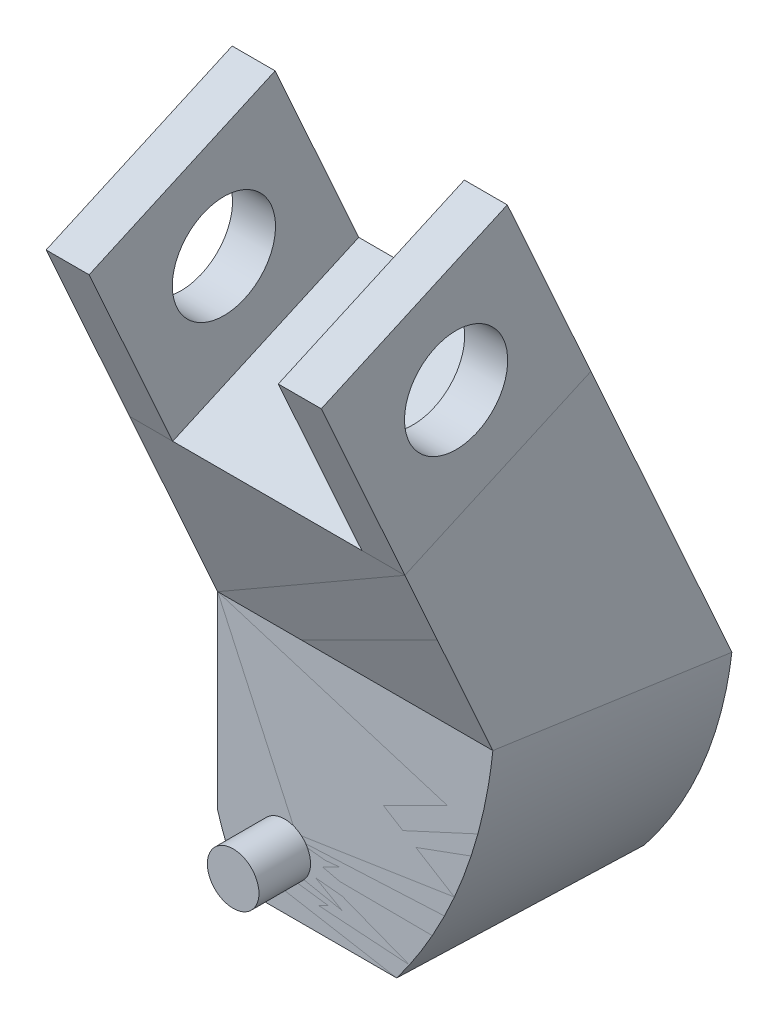
ISO-10303-21;
HEADER;
FILE_DESCRIPTION(('STEP AP214'),'2;1');
FILE_NAME('part.step','',(''),(''),'','','');
FILE_SCHEMA(('AUTOMOTIVE_DESIGN { 1 0 10303 214 1 1 1 1 }'));
ENDSEC;
DATA;
#1=APPLICATION_CONTEXT('core data for automotive mechanical design processes');
#2=APPLICATION_PROTOCOL_DEFINITION('international standard','automotive_design',2000,#1);
#3=PRODUCT_CONTEXT('',#1,'mechanical');
#4=PRODUCT('Part','Part','',(#3));
#5=PRODUCT_RELATED_PRODUCT_CATEGORY('part','',(#4));
#6=PRODUCT_DEFINITION_FORMATION('','',#4);
#7=PRODUCT_DEFINITION_CONTEXT('part definition',#1,'design');
#8=PRODUCT_DEFINITION('design','',#6,#7);
#9=PRODUCT_DEFINITION_SHAPE('','',#8);
#10=(LENGTH_UNIT() NAMED_UNIT(*) SI_UNIT(.MILLI.,.METRE.));
#11=(NAMED_UNIT(*) PLANE_ANGLE_UNIT() SI_UNIT($,.RADIAN.));
#12=(NAMED_UNIT(*) SI_UNIT($,.STERADIAN.) SOLID_ANGLE_UNIT());
#13=UNCERTAINTY_MEASURE_WITH_UNIT(LENGTH_MEASURE(1.E-05),#10,'distance_accuracy_value','');
#14=(GEOMETRIC_REPRESENTATION_CONTEXT(3) GLOBAL_UNCERTAINTY_ASSIGNED_CONTEXT((#13)) GLOBAL_UNIT_ASSIGNED_CONTEXT((#10,
#11,#12)) REPRESENTATION_CONTEXT('',''));
#15=CARTESIAN_POINT('',(0.,0.,0.));
#16=DIRECTION('',(0.,0.,1.));
#17=DIRECTION('',(1.,0.,0.));
#18=AXIS2_PLACEMENT_3D('',#15,#16,#17);
#19=CARTESIAN_POINT('',(12.1,38.0591056729542,-0.840706635576213));
#20=DIRECTION('',(-1.,0.,0.));
#21=DIRECTION('',(0.,0.,1.));
#22=AXIS2_PLACEMENT_3D('',#19,#20,#21);
#23=PLANE('',#22);
#24=CARTESIAN_POINT('',(12.1,30.2202806834827,2.1370854846149));
#25=DIRECTION('',(-1.,0.,0.));
#26=DIRECTION('',(0.,0.,1.));
#27=AXIS2_PLACEMENT_3D('',#24,#25,#26);
#28=CIRCLE('',#27,3.);
#29=CARTESIAN_POINT('',(12.1,30.2202806834827,5.1370854846149));
#30=VERTEX_POINT('',#29);
#31=EDGE_CURVE('E228',#30,#30,#28,.T.);
#32=ORIENTED_EDGE('',*,*,#31,.T.);
#33=EDGE_LOOP('',(#32));
#34=FACE_BOUND('',#33,.T.);
#35=DIRECTION('',(0.,0.409912939461552,-0.912124652699394));
#36=VECTOR('',#35,1.);
#37=CARTESIAN_POINT('',(12.1,27.2424930539879,-5.70174121076893));
#38=LINE('',#37,#36);
#39=CARTESIAN_POINT('',(12.1,22.3814556940113,5.11487760480601));
#40=VERTEX_POINT('',#39);
#41=CARTESIAN_POINT('',(12.1,27.2424930539879,-5.70174121076893));
#42=VERTEX_POINT('',#41);
#43=EDGE_CURVE('E225',#40,#42,#38,.T.);
#44=ORIENTED_EDGE('',*,*,#43,.T.);
#45=DIRECTION('',(0.,-0.912124652699394,-0.409912939461552));
#46=VECTOR('',#45,1.);
#47=CARTESIAN_POINT('',(12.1,38.0591056729542,-0.840706635576213));
#48=LINE('',#47,#46);
#49=CARTESIAN_POINT('',(12.1,38.0591056729542,-0.840706635576213));
#50=VERTEX_POINT('',#49);
#51=EDGE_CURVE('E14',#50,#42,#48,.T.);
#52=ORIENTED_EDGE('',*,*,#51,.F.);
#53=DIRECTION('',(0.,0.409912939461552,-0.912124652699394));
#54=VECTOR('',#53,1.);
#55=CARTESIAN_POINT('',(12.1,38.0591056729542,-0.840706635576213));
#56=LINE('',#55,#54);
#57=CARTESIAN_POINT('',(12.1,33.1980683129776,9.97591217999872));
#58=VERTEX_POINT('',#57);
#59=EDGE_CURVE('E212',#58,#50,#56,.T.);
#60=ORIENTED_EDGE('',*,*,#59,.F.);
#61=DIRECTION('',(0.,-0.912124652699394,-0.409912939461552));
#62=VECTOR('',#61,1.);
#63=CARTESIAN_POINT('',(12.1,33.1980683129776,9.97591217999872));
#64=LINE('',#63,#62);
#65=EDGE_CURVE('E221',#58,#40,#64,.T.);
#66=ORIENTED_EDGE('',*,*,#65,.T.);
#67=EDGE_LOOP('',(#44,#52,#60,#66));
#68=FACE_BOUND('',#67,.T.);
#69=ADVANCED_FACE('F160',(#34,#68),#23,.F.);
#70=CARTESIAN_POINT('',(12.1,38.0591056729542,-0.840706635576213));
#71=DIRECTION('',(0.,-0.409912939461552,0.912124652699394));
#72=DIRECTION('',(0.,-0.912124652699394,-0.409912939461552));
#73=AXIS2_PLACEMENT_3D('',#70,#71,#72);
#74=PLANE('',#73);
#75=DIRECTION('',(-1.,0.,0.));
#76=VECTOR('',#75,1.);
#77=CARTESIAN_POINT('',(12.1,27.2424930539879,-5.70174121076893));
#78=LINE('',#77,#76);
#79=CARTESIAN_POINT('',(9.6,27.2424930539879,-5.70174121076893));
#80=VERTEX_POINT('',#79);
#81=EDGE_CURVE('E216',#42,#80,#78,.T.);
#82=ORIENTED_EDGE('',*,*,#81,.T.);
#83=DIRECTION('',(0.,-0.912124652699394,-0.409912939461552));
#84=VECTOR('',#83,1.);
#85=CARTESIAN_POINT('',(9.6,38.0591056729542,-0.840706635576213));
#86=LINE('',#85,#84);
#87=CARTESIAN_POINT('',(9.6,38.0591056729542,-0.840706635576213));
#88=VERTEX_POINT('',#87);
#89=EDGE_CURVE('E169',#88,#80,#86,.T.);
#90=ORIENTED_EDGE('',*,*,#89,.F.);
#91=DIRECTION('',(-1.,0.,0.));
#92=VECTOR('',#91,1.);
#93=CARTESIAN_POINT('',(12.1,38.0591056729542,-0.840706635576213));
#94=LINE('',#93,#92);
#95=EDGE_CURVE('E207',#50,#88,#94,.T.);
#96=ORIENTED_EDGE('',*,*,#95,.F.);
#97=ORIENTED_EDGE('',*,*,#51,.T.);
#98=EDGE_LOOP('',(#82,#90,#96,#97));
#99=FACE_BOUND('',#98,.T.);
#100=ADVANCED_FACE('F215',(#99),#74,.F.);
#101=CARTESIAN_POINT('',(9.6,38.0591056729542,-0.840706635576213));
#102=DIRECTION('',(1.,0.,0.));
#103=DIRECTION('',(0.,0.,-1.));
#104=AXIS2_PLACEMENT_3D('',#101,#102,#103);
#105=PLANE('',#104);
#106=CARTESIAN_POINT('',(9.6,30.2202806834827,2.1370854846149));
#107=DIRECTION('',(1.,0.,0.));
#108=DIRECTION('',(0.,0.,-1.));
#109=AXIS2_PLACEMENT_3D('',#106,#107,#108);
#110=CIRCLE('',#109,3.);
#111=CARTESIAN_POINT('',(9.6,30.2202806834827,5.1370854846149));
#112=VERTEX_POINT('',#111);
#113=EDGE_CURVE('E163',#112,#112,#110,.T.);
#114=ORIENTED_EDGE('',*,*,#113,.T.);
#115=EDGE_LOOP('',(#114));
#116=FACE_BOUND('',#115,.T.);
#117=DIRECTION('',(0.,-0.409912939461552,0.912124652699394));
#118=VECTOR('',#117,1.);
#119=CARTESIAN_POINT('',(9.6,27.2424930539879,-5.70174121076893));
#120=LINE('',#119,#118);
#121=CARTESIAN_POINT('',(9.6,22.3814556940113,5.11487760480601));
#122=VERTEX_POINT('',#121);
#123=EDGE_CURVE('E194',#80,#122,#120,.T.);
#124=ORIENTED_EDGE('',*,*,#123,.T.);
#125=DIRECTION('',(0.,-0.912124652699394,-0.409912939461552));
#126=VECTOR('',#125,1.);
#127=CARTESIAN_POINT('',(9.6,33.1980683129776,9.97591217999872));
#128=LINE('',#127,#126);
#129=CARTESIAN_POINT('',(9.6,33.1980683129776,9.97591217999872));
#130=VERTEX_POINT('',#129);
#131=EDGE_CURVE('E217',#130,#122,#128,.T.);
#132=ORIENTED_EDGE('',*,*,#131,.F.);
#133=DIRECTION('',(0.,-0.409912939461552,0.912124652699394));
#134=VECTOR('',#133,1.);
#135=CARTESIAN_POINT('',(9.6,38.0591056729542,-0.840706635576213));
#136=LINE('',#135,#134);
#137=EDGE_CURVE('E210',#88,#130,#136,.T.);
#138=ORIENTED_EDGE('',*,*,#137,.F.);
#139=ORIENTED_EDGE('',*,*,#89,.T.);
#140=EDGE_LOOP('',(#124,#132,#138,#139));
#141=FACE_BOUND('',#140,.T.);
#142=ADVANCED_FACE('F219',(#116,#141),#105,.F.);
#143=CARTESIAN_POINT('',(12.1,33.1980683129776,9.97591217999872));
#144=DIRECTION('',(0.,0.409912939461552,-0.912124652699394));
#145=DIRECTION('',(0.,0.912124652699394,0.409912939461552));
#146=AXIS2_PLACEMENT_3D('',#143,#144,#145);
#147=PLANE('',#146);
#148=DIRECTION('',(1.,0.,0.));
#149=VECTOR('',#148,1.);
#150=CARTESIAN_POINT('',(12.1,22.3814556940113,5.11487760480601));
#151=LINE('',#150,#149);
#152=EDGE_CURVE('E200',#122,#40,#151,.T.);
#153=ORIENTED_EDGE('',*,*,#152,.T.);
#154=ORIENTED_EDGE('',*,*,#65,.F.);
#155=DIRECTION('',(1.,0.,0.));
#156=VECTOR('',#155,1.);
#157=CARTESIAN_POINT('',(12.1,33.1980683129776,9.97591217999872));
#158=LINE('',#157,#156);
#159=EDGE_CURVE('E177',#130,#58,#158,.T.);
#160=ORIENTED_EDGE('',*,*,#159,.F.);
#161=ORIENTED_EDGE('',*,*,#131,.T.);
#162=EDGE_LOOP('',(#153,#154,#160,#161));
#163=FACE_BOUND('',#162,.T.);
#164=ADVANCED_FACE('F233',(#163),#147,.F.);
#165=CARTESIAN_POINT('',(0.,31.3497535156595,14.0887208529756));
#166=DIRECTION('',(0.,-0.912124652699394,-0.409912939461553));
#167=DIRECTION('',(0.,0.409912939461552,-0.912124652699394));
#168=AXIS2_PLACEMENT_3D('',#165,#166,#167);
#169=PLANE('',#168);
#170=ORIENTED_EDGE('',*,*,#59,.T.);
#171=ORIENTED_EDGE('',*,*,#95,.T.);
#172=ORIENTED_EDGE('',*,*,#137,.T.);
#173=ORIENTED_EDGE('',*,*,#159,.T.);
#174=EDGE_LOOP('',(#170,#171,#172,#173));
#175=FACE_BOUND('',#174,.T.);
#176=ADVANCED_FACE('F208',(#175),#169,.F.);
#177=CARTESIAN_POINT('',(0.,20.5331408966932,9.22768627778292));
#178=DIRECTION('',(0.,-0.912124652699394,-0.409912939461553));
#179=DIRECTION('',(0.,0.409912939461552,-0.912124652699394));
#180=AXIS2_PLACEMENT_3D('',#177,#178,#179);
#181=PLANE('',#180);
#182=ORIENTED_EDGE('',*,*,#43,.F.);
#183=ORIENTED_EDGE('',*,*,#152,.F.);
#184=ORIENTED_EDGE('',*,*,#123,.F.);
#185=ORIENTED_EDGE('',*,*,#81,.F.);
#186=EDGE_LOOP('',(#182,#183,#184,#185));
#187=FACE_BOUND('',#186,.T.);
#188=ADVANCED_FACE('F236',(#187),#181,.T.);
#189=CARTESIAN_POINT('',(12.9587,30.2202806834827,2.1370854846149));
#190=DIRECTION('',(-1.,0.,0.));
#191=DIRECTION('',(0.,0.,1.));
#192=AXIS2_PLACEMENT_3D('',#189,#190,#191);
#193=CYLINDRICAL_SURFACE('',#192,3.);
#194=CARTESIAN_POINT('',(9.6,30.2202806834827,5.1370854846149));
#195=CARTESIAN_POINT('',(9.62604166666667,30.2202806834827,5.1370854846149));
#196=CARTESIAN_POINT('',(9.65208333333334,30.2202806834827,5.1370854846149));
#197=CARTESIAN_POINT('',(9.70416666666667,30.2202806834827,5.1370854846149));
#198=CARTESIAN_POINT('',(9.73020833333334,30.2202806834827,5.1370854846149));
#199=CARTESIAN_POINT('',(9.78229166666667,30.2202806834827,5.1370854846149));
#200=CARTESIAN_POINT('',(9.80833333333333,30.2202806834827,5.1370854846149));
#201=CARTESIAN_POINT('',(9.86041666666667,30.2202806834827,5.1370854846149));
#202=CARTESIAN_POINT('',(9.88645833333333,30.2202806834827,5.1370854846149));
#203=CARTESIAN_POINT('',(9.93854166666667,30.2202806834827,5.1370854846149));
#204=CARTESIAN_POINT('',(9.96458333333333,30.2202806834827,5.1370854846149));
#205=CARTESIAN_POINT('',(10.0166666666667,30.2202806834827,5.1370854846149));
#206=CARTESIAN_POINT('',(10.0427083333333,30.2202806834827,5.1370854846149));
#207=CARTESIAN_POINT('',(10.0947916666667,30.2202806834827,5.1370854846149));
#208=CARTESIAN_POINT('',(10.1208333333333,30.2202806834827,5.1370854846149));
#209=CARTESIAN_POINT('',(10.1729166666667,30.2202806834827,5.1370854846149));
#210=CARTESIAN_POINT('',(10.1989583333333,30.2202806834827,5.1370854846149));
#211=CARTESIAN_POINT('',(10.2510416666667,30.2202806834827,5.1370854846149));
#212=CARTESIAN_POINT('',(10.2770833333333,30.2202806834827,5.1370854846149));
#213=CARTESIAN_POINT('',(10.3291666666667,30.2202806834827,5.1370854846149));
#214=CARTESIAN_POINT('',(10.3552083333333,30.2202806834827,5.1370854846149));
#215=CARTESIAN_POINT('',(10.4072916666667,30.2202806834827,5.1370854846149));
#216=CARTESIAN_POINT('',(10.4333333333333,30.2202806834827,5.1370854846149));
#217=CARTESIAN_POINT('',(10.4854166666667,30.2202806834827,5.1370854846149));
#218=CARTESIAN_POINT('',(10.5114583333333,30.2202806834827,5.1370854846149));
#219=CARTESIAN_POINT('',(10.5635416666667,30.2202806834827,5.1370854846149));
#220=CARTESIAN_POINT('',(10.5895833333333,30.2202806834827,5.1370854846149));
#221=CARTESIAN_POINT('',(10.6416666666667,30.2202806834827,5.1370854846149));
#222=CARTESIAN_POINT('',(10.6677083333333,30.2202806834827,5.1370854846149));
#223=CARTESIAN_POINT('',(10.7197916666667,30.2202806834827,5.1370854846149));
#224=CARTESIAN_POINT('',(10.7458333333333,30.2202806834827,5.1370854846149));
#225=CARTESIAN_POINT('',(10.7979166666667,30.2202806834827,5.1370854846149));
#226=CARTESIAN_POINT('',(10.8239583333333,30.2202806834827,5.1370854846149));
#227=CARTESIAN_POINT('',(10.8760416666667,30.2202806834827,5.1370854846149));
#228=CARTESIAN_POINT('',(10.9020833333333,30.2202806834827,5.1370854846149));
#229=CARTESIAN_POINT('',(10.9541666666667,30.2202806834827,5.1370854846149));
#230=CARTESIAN_POINT('',(10.9802083333333,30.2202806834827,5.1370854846149));
#231=CARTESIAN_POINT('',(11.0322916666667,30.2202806834827,5.1370854846149));
#232=CARTESIAN_POINT('',(11.0583333333333,30.2202806834827,5.1370854846149));
#233=CARTESIAN_POINT('',(11.1104166666667,30.2202806834827,5.1370854846149));
#234=CARTESIAN_POINT('',(11.1364583333333,30.2202806834827,5.1370854846149));
#235=CARTESIAN_POINT('',(11.1885416666667,30.2202806834827,5.1370854846149));
#236=CARTESIAN_POINT('',(11.2145833333333,30.2202806834827,5.1370854846149));
#237=CARTESIAN_POINT('',(11.2666666666667,30.2202806834827,5.1370854846149));
#238=CARTESIAN_POINT('',(11.2927083333333,30.2202806834827,5.1370854846149));
#239=CARTESIAN_POINT('',(11.3447916666667,30.2202806834827,5.1370854846149));
#240=CARTESIAN_POINT('',(11.3708333333333,30.2202806834827,5.1370854846149));
#241=CARTESIAN_POINT('',(11.4229166666667,30.2202806834827,5.1370854846149));
#242=CARTESIAN_POINT('',(11.4489583333333,30.2202806834827,5.1370854846149));
#243=CARTESIAN_POINT('',(11.5010416666667,30.2202806834827,5.1370854846149));
#244=CARTESIAN_POINT('',(11.5270833333333,30.2202806834827,5.1370854846149));
#245=CARTESIAN_POINT('',(11.5791666666667,30.2202806834827,5.1370854846149));
#246=CARTESIAN_POINT('',(11.6052083333333,30.2202806834827,5.1370854846149));
#247=CARTESIAN_POINT('',(11.6572916666667,30.2202806834827,5.1370854846149));
#248=CARTESIAN_POINT('',(11.6833333333333,30.2202806834827,5.1370854846149));
#249=CARTESIAN_POINT('',(11.7354166666667,30.2202806834827,5.1370854846149));
#250=CARTESIAN_POINT('',(11.7614583333333,30.2202806834827,5.1370854846149));
#251=CARTESIAN_POINT('',(11.8135416666667,30.2202806834827,5.1370854846149));
#252=CARTESIAN_POINT('',(11.8395833333333,30.2202806834827,5.1370854846149));
#253=CARTESIAN_POINT('',(11.8916666666667,30.2202806834827,5.1370854846149));
#254=CARTESIAN_POINT('',(11.9177083333333,30.2202806834827,5.1370854846149));
#255=CARTESIAN_POINT('',(11.9697916666667,30.2202806834827,5.1370854846149));
#256=CARTESIAN_POINT('',(11.9958333333333,30.2202806834827,5.1370854846149));
#257=CARTESIAN_POINT('',(12.0479166666667,30.2202806834827,5.1370854846149));
#258=CARTESIAN_POINT('',(12.0739583333333,30.2202806834827,5.1370854846149));
#259=CARTESIAN_POINT('',(12.1,30.2202806834827,5.1370854846149));
#260=B_SPLINE_CURVE_WITH_KNOTS('',3,(#194,#195,#196,#197,#198,#199,#200,#201,#202,#203,#204,
#205,#206,#207,#208,#209,#210,#211,#212,#213,#214,#215,#216,#217,#218,#219,#220,#221,#222,#223,
#224,#225,#226,#227,#228,#229,#230,#231,#232,#233,#234,#235,#236,#237,#238,#239,#240,#241,#242,
#243,#244,#245,#246,#247,#248,#249,#250,#251,#252,#253,#254,#255,#256,#257,#258,#259),
.UNSPECIFIED.,.F.,.F.,(4,2,2,2,2,2,2,2,2,2,2,2,2,2,2,2,2,2,2,2,2,2,2,2,2,2,2,2,2,2,2,2,4),(0.,
0.0781250000000018,0.15625,0.234375,0.3125,0.390625,0.46875,0.546875,0.625000000000001,
0.703125000000001,0.781250000000001,0.859375000000001,0.937500000000001,1.015625,1.09375,
1.171875,1.25,1.328125,1.40625,1.484375,1.5625,1.640625,1.71875,1.796875,1.875,1.953125,2.03125,
2.109375,2.1875,2.265625,2.34375,2.421875,2.5),.UNSPECIFIED.);
#261=EDGE_CURVE('BSEAM246',#112,#30,#260,.T.);
#262=ORIENTED_EDGE('',*,*,#113,.F.);
#263=ORIENTED_EDGE('',*,*,#31,.F.);
#264=ORIENTED_EDGE('',*,*,#261,.T.);
#265=ORIENTED_EDGE('',*,*,#261,.F.);
#266=EDGE_LOOP('',(#262,#264,#263,#265));
#267=FACE_BOUND('',#266,.T.);
#268=ADVANCED_FACE('F246',(#267),#193,.F.);
#269=CLOSED_SHELL('',(#69,#100,#142,#164,#176,#188,#268));
#270=MANIFOLD_SOLID_BREP('B2',#269);
#271=CARTESIAN_POINT('',(-3.9,38.0591056729542,-0.840706635576213));
#272=DIRECTION('',(1.,0.,0.));
#273=DIRECTION('',(0.,0.,-1.));
#274=AXIS2_PLACEMENT_3D('',#271,#272,#273);
#275=PLANE('',#274);
#276=CARTESIAN_POINT('',(-3.9,30.2202806834827,2.1370854846149));
#277=DIRECTION('',(-1.,0.,0.));
#278=DIRECTION('',(0.,0.,1.));
#279=AXIS2_PLACEMENT_3D('',#276,#277,#278);
#280=CIRCLE('',#279,3.);
#281=CARTESIAN_POINT('',(-3.9,30.2202806834827,5.1370854846149));
#282=VERTEX_POINT('',#281);
#283=EDGE_CURVE('E393',#282,#282,#280,.T.);
#284=ORIENTED_EDGE('',*,*,#283,.F.);
#285=EDGE_LOOP('',(#284));
#286=FACE_BOUND('',#285,.T.);
#287=DIRECTION('',(0.,-0.409912939461552,0.912124652699394));
#288=VECTOR('',#287,1.);
#289=CARTESIAN_POINT('',(-3.9,27.2424930539879,-5.70174121076893));
#290=LINE('',#289,#288);
#291=CARTESIAN_POINT('',(-3.9,27.2424930539879,-5.70174121076893));
#292=VERTEX_POINT('',#291);
#293=CARTESIAN_POINT('',(-3.9,22.3814556940113,5.11487760480601));
#294=VERTEX_POINT('',#293);
#295=EDGE_CURVE('E380',#292,#294,#290,.T.);
#296=ORIENTED_EDGE('',*,*,#295,.T.);
#297=DIRECTION('',(0.,-0.912124652699394,-0.409912939461552));
#298=VECTOR('',#297,1.);
#299=CARTESIAN_POINT('',(-3.9,33.1980683129776,9.97591217999872));
#300=LINE('',#299,#298);
#301=CARTESIAN_POINT('',(-3.9,33.1980683129776,9.97591217999872));
#302=VERTEX_POINT('',#301);
#303=EDGE_CURVE('E158',#302,#294,#300,.T.);
#304=ORIENTED_EDGE('',*,*,#303,.F.);
#305=DIRECTION('',(0.,-0.409912939461552,0.912124652699394));
#306=VECTOR('',#305,1.);
#307=CARTESIAN_POINT('',(-3.9,38.0591056729542,-0.840706635576213));
#308=LINE('',#307,#306);
#309=CARTESIAN_POINT('',(-3.9,38.0591056729542,-0.840706635576213));
#310=VERTEX_POINT('',#309);
#311=EDGE_CURVE('E367',#310,#302,#308,.T.);
#312=ORIENTED_EDGE('',*,*,#311,.F.);
#313=DIRECTION('',(0.,-0.912124652699394,-0.409912939461552));
#314=VECTOR('',#313,1.);
#315=CARTESIAN_POINT('',(-3.9,38.0591056729542,-0.840706635576213));
#316=LINE('',#315,#314);
#317=EDGE_CURVE('E376',#310,#292,#316,.T.);
#318=ORIENTED_EDGE('',*,*,#317,.T.);
#319=EDGE_LOOP('',(#296,#304,#312,#318));
#320=FACE_BOUND('',#319,.T.);
#321=ADVANCED_FACE('F315',(#286,#320),#275,.F.);
#322=CARTESIAN_POINT('',(-3.9,33.1980683129776,9.97591217999872));
#323=DIRECTION('',(0.,0.409912939461552,-0.912124652699394));
#324=DIRECTION('',(0.,0.912124652699394,0.409912939461552));
#325=AXIS2_PLACEMENT_3D('',#322,#323,#324);
#326=PLANE('',#325);
#327=DIRECTION('',(1.,0.,0.));
#328=VECTOR('',#327,1.);
#329=CARTESIAN_POINT('',(-3.9,22.3814556940113,5.11487760480601));
#330=LINE('',#329,#328);
#331=CARTESIAN_POINT('',(-1.4,22.3814556940113,5.11487760480601));
#332=VERTEX_POINT('',#331);
#333=EDGE_CURVE('E371',#294,#332,#330,.T.);
#334=ORIENTED_EDGE('',*,*,#333,.T.);
#335=DIRECTION('',(0.,-0.912124652699394,-0.409912939461552));
#336=VECTOR('',#335,1.);
#337=CARTESIAN_POINT('',(-1.4,33.1980683129776,9.97591217999872));
#338=LINE('',#337,#336);
#339=CARTESIAN_POINT('',(-1.4,33.1980683129776,9.97591217999872));
#340=VERTEX_POINT('',#339);
#341=EDGE_CURVE('E324',#340,#332,#338,.T.);
#342=ORIENTED_EDGE('',*,*,#341,.F.);
#343=DIRECTION('',(1.,0.,0.));
#344=VECTOR('',#343,1.);
#345=CARTESIAN_POINT('',(-3.9,33.1980683129776,9.97591217999872));
#346=LINE('',#345,#344);
#347=EDGE_CURVE('E362',#302,#340,#346,.T.);
#348=ORIENTED_EDGE('',*,*,#347,.F.);
#349=ORIENTED_EDGE('',*,*,#303,.T.);
#350=EDGE_LOOP('',(#334,#342,#348,#349));
#351=FACE_BOUND('',#350,.T.);
#352=ADVANCED_FACE('F370',(#351),#326,.F.);
#353=CARTESIAN_POINT('',(-1.4,38.0591056729542,-0.840706635576213));
#354=DIRECTION('',(-1.,0.,0.));
#355=DIRECTION('',(0.,0.,1.));
#356=AXIS2_PLACEMENT_3D('',#353,#354,#355);
#357=PLANE('',#356);
#358=CARTESIAN_POINT('',(-1.4,30.2202806834827,2.1370854846149));
#359=DIRECTION('',(-1.,0.,0.));
#360=DIRECTION('',(0.,0.,1.));
#361=AXIS2_PLACEMENT_3D('',#358,#359,#360);
#362=CIRCLE('',#361,3.);
#363=CARTESIAN_POINT('',(-1.4,30.2202806834827,5.1370854846149));
#364=VERTEX_POINT('',#363);
#365=EDGE_CURVE('E318',#364,#364,#362,.T.);
#366=ORIENTED_EDGE('',*,*,#365,.T.);
#367=EDGE_LOOP('',(#366));
#368=FACE_BOUND('',#367,.T.);
#369=DIRECTION('',(0.,0.409912939461552,-0.912124652699394));
#370=VECTOR('',#369,1.);
#371=CARTESIAN_POINT('',(-1.4,27.2424930539879,-5.70174121076893));
#372=LINE('',#371,#370);
#373=CARTESIAN_POINT('',(-1.4,27.2424930539879,-5.70174121076893));
#374=VERTEX_POINT('',#373);
#375=EDGE_CURVE('E349',#332,#374,#372,.T.);
#376=ORIENTED_EDGE('',*,*,#375,.T.);
#377=DIRECTION('',(0.,-0.912124652699394,-0.409912939461552));
#378=VECTOR('',#377,1.);
#379=CARTESIAN_POINT('',(-1.4,38.0591056729542,-0.840706635576213));
#380=LINE('',#379,#378);
#381=CARTESIAN_POINT('',(-1.4,38.0591056729542,-0.840706635576213));
#382=VERTEX_POINT('',#381);
#383=EDGE_CURVE('E372',#382,#374,#380,.T.);
#384=ORIENTED_EDGE('',*,*,#383,.F.);
#385=DIRECTION('',(0.,0.409912939461552,-0.912124652699394));
#386=VECTOR('',#385,1.);
#387=CARTESIAN_POINT('',(-1.4,38.0591056729542,-0.840706635576213));
#388=LINE('',#387,#386);
#389=EDGE_CURVE('E365',#340,#382,#388,.T.);
#390=ORIENTED_EDGE('',*,*,#389,.F.);
#391=ORIENTED_EDGE('',*,*,#341,.T.);
#392=EDGE_LOOP('',(#376,#384,#390,#391));
#393=FACE_BOUND('',#392,.T.);
#394=ADVANCED_FACE('F374',(#368,#393),#357,.F.);
#395=CARTESIAN_POINT('',(-3.9,38.0591056729542,-0.840706635576213));
#396=DIRECTION('',(0.,-0.409912939461552,0.912124652699394));
#397=DIRECTION('',(0.,-0.912124652699394,-0.409912939461552));
#398=AXIS2_PLACEMENT_3D('',#395,#396,#397);
#399=PLANE('',#398);
#400=DIRECTION('',(-1.,0.,0.));
#401=VECTOR('',#400,1.);
#402=CARTESIAN_POINT('',(-3.9,27.2424930539879,-5.70174121076893));
#403=LINE('',#402,#401);
#404=EDGE_CURVE('E355',#374,#292,#403,.T.);
#405=ORIENTED_EDGE('',*,*,#404,.T.);
#406=ORIENTED_EDGE('',*,*,#317,.F.);
#407=DIRECTION('',(-1.,0.,0.));
#408=VECTOR('',#407,1.);
#409=CARTESIAN_POINT('',(-3.9,38.0591056729542,-0.840706635576213));
#410=LINE('',#409,#408);
#411=EDGE_CURVE('E332',#382,#310,#410,.T.);
#412=ORIENTED_EDGE('',*,*,#411,.F.);
#413=ORIENTED_EDGE('',*,*,#383,.T.);
#414=EDGE_LOOP('',(#405,#406,#412,#413));
#415=FACE_BOUND('',#414,.T.);
#416=ADVANCED_FACE('F387',(#415),#399,.F.);
#417=CARTESIAN_POINT('',(0.,31.3497535156595,14.0887208529756));
#418=DIRECTION('',(0.,0.912124652699394,0.409912939461553));
#419=DIRECTION('',(0.,-0.409912939461552,0.912124652699394));
#420=AXIS2_PLACEMENT_3D('',#417,#418,#419);
#421=PLANE('',#420);
#422=ORIENTED_EDGE('',*,*,#311,.T.);
#423=ORIENTED_EDGE('',*,*,#347,.T.);
#424=ORIENTED_EDGE('',*,*,#389,.T.);
#425=ORIENTED_EDGE('',*,*,#411,.T.);
#426=EDGE_LOOP('',(#422,#423,#424,#425));
#427=FACE_BOUND('',#426,.T.);
#428=ADVANCED_FACE('F363',(#427),#421,.T.);
#429=CARTESIAN_POINT('',(0.,20.5331408966932,9.22768627778292));
#430=DIRECTION('',(0.,0.912124652699394,0.409912939461553));
#431=DIRECTION('',(0.,-0.409912939461552,0.912124652699394));
#432=AXIS2_PLACEMENT_3D('',#429,#430,#431);
#433=PLANE('',#432);
#434=ORIENTED_EDGE('',*,*,#295,.F.);
#435=ORIENTED_EDGE('',*,*,#404,.F.);
#436=ORIENTED_EDGE('',*,*,#375,.F.);
#437=ORIENTED_EDGE('',*,*,#333,.F.);
#438=EDGE_LOOP('',(#434,#435,#436,#437));
#439=FACE_BOUND('',#438,.T.);
#440=ADVANCED_FACE('F390',(#439),#433,.F.);
#441=CARTESIAN_POINT('',(12.9587,30.2202806834827,2.1370854846149));
#442=DIRECTION('',(-1.,0.,0.));
#443=DIRECTION('',(0.,0.,1.));
#444=AXIS2_PLACEMENT_3D('',#441,#442,#443);
#445=CYLINDRICAL_SURFACE('',#444,3.);
#446=ORIENTED_EDGE('',*,*,#283,.T.);
#447=EDGE_LOOP('',(#446));
#448=FACE_BOUND('',#447,.T.);
#449=ORIENTED_EDGE('',*,*,#365,.F.);
#450=EDGE_LOOP('',(#449));
#451=FACE_BOUND('',#450,.T.);
#452=ADVANCED_FACE('F401',(#448,#451),#445,.F.);
#453=CLOSED_SHELL('',(#321,#352,#394,#416,#428,#440,#452));
#454=MANIFOLD_SOLID_BREP('B8',#453);
#455=CARTESIAN_POINT('',(-2.50366957823471,-3.25,-13.9));
#456=DIRECTION('',(0.,0.,1.));
#457=DIRECTION('',(1.,0.,0.));
#458=AXIS2_PLACEMENT_3D('',#455,#456,#457);
#459=PLANE('',#458);
#460=DIRECTION('',(1.,0.,0.));
#461=VECTOR('',#460,1.);
#462=CARTESIAN_POINT('',(2.25421195331569,-3.25,-13.9));
#463=LINE('',#462,#461);
#464=CARTESIAN_POINT('',(-2.50366957823471,-3.25,-13.9));
#465=VERTEX_POINT('',#464);
#466=CARTESIAN_POINT('',(7.01209348486609,-3.25,-13.9));
#467=VERTEX_POINT('',#466);
#468=EDGE_CURVE('E470',#465,#467,#463,.T.);
#469=ORIENTED_EDGE('',*,*,#468,.T.);
#470=CARTESIAN_POINT('',(7.01209348486609,-3.25,-13.9));
#471=CARTESIAN_POINT('',(7.7999515867321,-2.25504478279566,-13.9));
#472=CARTESIAN_POINT('',(8.50801417731572,-1.2008900867081,-13.9));
#473=CARTESIAN_POINT('',(9.13021944318803,-0.0977166347529154,-13.9));
#474=B_SPLINE_CURVE_WITH_KNOTS('',3,(#470,#471,#472,#473),.UNSPECIFIED.,.F.,.F.,(4,4),(0.,
0.284365426471022),.UNSPECIFIED.);
#475=CARTESIAN_POINT('',(9.13021944318803,-0.0977166347529154,-13.9));
#476=VERTEX_POINT('',#475);
#477=EDGE_CURVE('E475',#467,#476,#474,.T.);
#478=ORIENTED_EDGE('',*,*,#477,.T.);
#479=CARTESIAN_POINT('',(9.13021944318803,-0.0977166347529154,-13.9));
#480=CARTESIAN_POINT('',(10.6960623996115,2.67853177425995,-13.9));
#481=CARTESIAN_POINT('',(11.7181464372474,5.76522994140953,-13.9));
#482=CARTESIAN_POINT('',(12.1,9.,-13.9));
#483=B_SPLINE_CURVE_WITH_KNOTS('',3,(#479,#480,#481,#482),.UNSPECIFIED.,.F.,.F.,(4,4),
(0.284365426471022,1.),.UNSPECIFIED.);
#484=CARTESIAN_POINT('',(12.1,9.,-13.9));
#485=VERTEX_POINT('',#484);
#486=EDGE_CURVE('E313',#476,#485,#483,.T.);
#487=ORIENTED_EDGE('',*,*,#486,.T.);
#488=DIRECTION('',(1.,0.,0.));
#489=VECTOR('',#488,1.);
#490=CARTESIAN_POINT('',(4.1,9.,-13.9));
#491=LINE('',#490,#489);
#492=CARTESIAN_POINT('',(-3.9,9.,-13.9));
#493=VERTEX_POINT('',#492);
#494=EDGE_CURVE('E501',#493,#485,#491,.T.);
#495=ORIENTED_EDGE('',*,*,#494,.F.);
#496=DIRECTION('',(0.,1.,0.));
#497=VECTOR('',#496,1.);
#498=CARTESIAN_POINT('',(-3.9,4.49999999999999,-13.9));
#499=LINE('',#498,#497);
#500=CARTESIAN_POINT('',(-3.9,0.,-13.9));
#501=VERTEX_POINT('',#500);
#502=EDGE_CURVE('E495',#501,#493,#499,.T.);
#503=ORIENTED_EDGE('',*,*,#502,.F.);
#504=CARTESIAN_POINT('',(-2.50366957823471,-3.25,-13.9));
#505=CARTESIAN_POINT('',(-3.09698120568703,-2.23537666161022,-13.9));
#506=CARTESIAN_POINT('',(-3.56774064533487,-1.1448437300672,-13.9));
#507=CARTESIAN_POINT('',(-3.9,0.,-13.9));
#508=B_SPLINE_CURVE_WITH_KNOTS('',3,(#504,#505,#506,#507),.UNSPECIFIED.,.F.,.F.,(4,4),(0.,
0.284365426471022),.UNSPECIFIED.);
#509=EDGE_CURVE('E499',#465,#501,#508,.T.);
#510=ORIENTED_EDGE('',*,*,#509,.F.);
#511=EDGE_LOOP('',(#469,#478,#487,#495,#503,#510));
#512=FACE_BOUND('',#511,.T.);
#513=ADVANCED_FACE('F469',(#512),#459,.T.);
#514=OPEN_SHELL('',(#513));
#515=SHELL_BASED_SURFACE_MODEL('B152',(#514));
#516=CARTESIAN_POINT('',(6.50928726000864,-3.25,0.));
#517=DIRECTION('',(0.,0.,-1.));
#518=DIRECTION('',(-1.,0.,0.));
#519=AXIS2_PLACEMENT_3D('',#516,#517,#518);
#520=PLANE('',#519);
#521=DIRECTION('',(-1.,0.,0.));
#522=VECTOR('',#521,1.);
#523=CARTESIAN_POINT('',(2.00280884088696,-3.25,0.));
#524=LINE('',#523,#522);
#525=CARTESIAN_POINT('',(6.50928726000864,-3.25,0.));
#526=VERTEX_POINT('',#525);
#527=CARTESIAN_POINT('',(-2.50366957823471,-3.25,0.));
#528=VERTEX_POINT('',#527);
#529=EDGE_CURVE('E556',#526,#528,#524,.T.);
#530=ORIENTED_EDGE('',*,*,#529,.T.);
#531=CARTESIAN_POINT('',(-2.50366957823471,-3.25,0.));
#532=CARTESIAN_POINT('',(-3.09698120569303,-2.23537666159633,0.));
#533=CARTESIAN_POINT('',(-3.56774064533698,-1.14484373005991,0.));
#534=CARTESIAN_POINT('',(-3.9,0.,0.));
#535=B_SPLINE_CURVE_WITH_KNOTS('',3,(#531,#532,#533,#534),.UNSPECIFIED.,.F.,.F.,(4,4),(0.,
0.245347790584881),.UNSPECIFIED.);
#536=CARTESIAN_POINT('',(-3.9,0.,0.));
#537=VERTEX_POINT('',#536);
#538=EDGE_CURVE('E561',#528,#537,#535,.T.);
#539=ORIENTED_EDGE('',*,*,#538,.T.);
#540=DIRECTION('',(0.,1.,0.));
#541=VECTOR('',#540,1.);
#542=CARTESIAN_POINT('',(-3.9,5.5,0.));
#543=LINE('',#542,#541);
#544=CARTESIAN_POINT('',(-3.9,11.,0.));
#545=VERTEX_POINT('',#544);
#546=EDGE_CURVE('E467',#537,#545,#543,.T.);
#547=ORIENTED_EDGE('',*,*,#546,.T.);
#548=DIRECTION('',(-1.,0.,0.));
#549=VECTOR('',#548,1.);
#550=CARTESIAN_POINT('',(4.1,11.,0.));
#551=LINE('',#550,#549);
#552=CARTESIAN_POINT('',(12.1,11.,0.));
#553=VERTEX_POINT('',#552);
#554=EDGE_CURVE('E587',#553,#545,#551,.T.);
#555=ORIENTED_EDGE('',*,*,#554,.F.);
#556=CARTESIAN_POINT('',(8.57933103382357,-0.07981088476205,0.));
#557=CARTESIAN_POINT('',(10.4813812065785,3.30271155368236,0.));
#558=CARTESIAN_POINT('',(11.6933488410233,7.06824075309156,0.));
#559=CARTESIAN_POINT('',(12.1,11.,0.));
#560=B_SPLINE_CURVE_WITH_KNOTS('',3,(#556,#557,#558,#559),.UNSPECIFIED.,.F.,.F.,(4,4),
(0.245347790584881,1.),.UNSPECIFIED.);
#561=CARTESIAN_POINT('',(8.57933103382357,-0.07981088476205,0.));
#562=VERTEX_POINT('',#561);
#563=EDGE_CURVE('E581',#562,#553,#560,.T.);
#564=ORIENTED_EDGE('',*,*,#563,.F.);
#565=CARTESIAN_POINT('',(6.50928726000864,-3.25,0.));
#566=CARTESIAN_POINT('',(7.26962481309998,-2.23873641549136,0.));
#567=CARTESIAN_POINT('',(7.96094841777228,-1.17951535328711,0.));
#568=CARTESIAN_POINT('',(8.57933103382357,-0.07981088476205,0.));
#569=B_SPLINE_CURVE_WITH_KNOTS('',3,(#565,#566,#567,#568),.UNSPECIFIED.,.F.,.F.,(4,4),(0.,
0.245347790584881),.UNSPECIFIED.);
#570=EDGE_CURVE('E585',#526,#562,#569,.T.);
#571=ORIENTED_EDGE('',*,*,#570,.F.);
#572=EDGE_LOOP('',(#530,#539,#547,#555,#564,#571));
#573=FACE_BOUND('',#572,.T.);
#574=ADVANCED_FACE('F555',(#573),#520,.T.);
#575=OPEN_SHELL('',(#574));
#576=SHELL_BASED_SURFACE_MODEL('B307',(#575));
#577=CARTESIAN_POINT('',(0.,6.70935215729476,-14.9294274885519));
#578=DIRECTION('',(0.,-0.409912939461553,0.912124652699393));
#579=DIRECTION('',(0.,-0.912124652699393,-0.409912939461553));
#580=AXIS2_PLACEMENT_3D('',#577,#578,#579);
#581=PLANE('',#580);
#582=DIRECTION('',(1.,0.,0.));
#583=VECTOR('',#582,1.);
#584=CARTESIAN_POINT('',(-3.9,27.2424930539879,-5.70174121076893));
#585=LINE('',#584,#583);
#586=CARTESIAN_POINT('',(-3.9,27.2424930539879,-5.70174121076893));
#587=VERTEX_POINT('',#586);
#588=CARTESIAN_POINT('',(12.1,27.2424930539879,-5.70174121076893));
#589=VERTEX_POINT('',#588);
#590=EDGE_CURVE('E642',#587,#589,#585,.T.);
#591=ORIENTED_EDGE('',*,*,#590,.T.);
#592=DIRECTION('',(0.,0.912124652699393,0.409912939461553));
#593=VECTOR('',#592,1.);
#594=CARTESIAN_POINT('',(12.1,9.,-13.9));
#595=LINE('',#594,#593);
#596=CARTESIAN_POINT('',(12.1,9.,-13.9));
#597=VERTEX_POINT('',#596);
#598=EDGE_CURVE('E657',#597,#589,#595,.T.);
#599=ORIENTED_EDGE('',*,*,#598,.F.);
#600=DIRECTION('',(1.,0.,0.));
#601=VECTOR('',#600,1.);
#602=CARTESIAN_POINT('',(-3.9,9.,-13.9));
#603=LINE('',#602,#601);
#604=CARTESIAN_POINT('',(-3.9,9.,-13.9));
#605=VERTEX_POINT('',#604);
#606=EDGE_CURVE('E647',#605,#597,#603,.T.);
#607=ORIENTED_EDGE('',*,*,#606,.F.);
#608=DIRECTION('',(0.,0.912124652699393,0.409912939461553));
#609=VECTOR('',#608,1.);
#610=CARTESIAN_POINT('',(-3.9,9.,-13.9));
#611=LINE('',#610,#609);
#612=EDGE_CURVE('E553',#605,#587,#611,.T.);
#613=ORIENTED_EDGE('',*,*,#612,.T.);
#614=EDGE_LOOP('',(#591,#599,#607,#613));
#615=FACE_BOUND('',#614,.T.);
#616=ADVANCED_FACE('F641',(#615),#581,.F.);
#617=OPEN_SHELL('',(#616));
#618=SHELL_BASED_SURFACE_MODEL('B461',(#617));
#619=CARTESIAN_POINT('',(0.,1.84831479731812,-4.11280867297693));
#620=DIRECTION('',(0.,0.409912939461553,-0.912124652699393));
#621=DIRECTION('',(0.,0.912124652699393,0.409912939461553));
#622=AXIS2_PLACEMENT_3D('',#619,#620,#621);
#623=PLANE('',#622);
#624=DIRECTION('',(-1.,0.,0.));
#625=VECTOR('',#624,1.);
#626=CARTESIAN_POINT('',(12.1,11.,0.));
#627=LINE('',#626,#625);
#628=CARTESIAN_POINT('',(12.1,11.,0.));
#629=VERTEX_POINT('',#628);
#630=CARTESIAN_POINT('',(-3.9,11.,0.));
#631=VERTEX_POINT('',#630);
#632=EDGE_CURVE('E694',#629,#631,#627,.T.);
#633=ORIENTED_EDGE('',*,*,#632,.T.);
#634=DIRECTION('',(0.,0.912124652699393,0.409912939461553));
#635=VECTOR('',#634,1.);
#636=CARTESIAN_POINT('',(-3.9,11.,0.));
#637=LINE('',#636,#635);
#638=CARTESIAN_POINT('',(-3.9,22.3814556940112,5.114877604806));
#639=VERTEX_POINT('',#638);
#640=EDGE_CURVE('E710',#631,#639,#637,.T.);
#641=ORIENTED_EDGE('',*,*,#640,.T.);
#642=DIRECTION('',(-1.,0.,0.));
#643=VECTOR('',#642,1.);
#644=CARTESIAN_POINT('',(12.1,22.3814556940112,5.114877604806));
#645=LINE('',#644,#643);
#646=CARTESIAN_POINT('',(12.1,22.3814556940112,5.114877604806));
#647=VERTEX_POINT('',#646);
#648=EDGE_CURVE('E699',#647,#639,#645,.T.);
#649=ORIENTED_EDGE('',*,*,#648,.F.);
#650=DIRECTION('',(0.,0.912124652699393,0.409912939461553));
#651=VECTOR('',#650,1.);
#652=CARTESIAN_POINT('',(12.1,11.,0.));
#653=LINE('',#652,#651);
#654=EDGE_CURVE('E639',#629,#647,#653,.T.);
#655=ORIENTED_EDGE('',*,*,#654,.F.);
#656=EDGE_LOOP('',(#633,#641,#649,#655));
#657=FACE_BOUND('',#656,.T.);
#658=ADVANCED_FACE('F693',(#657),#623,.T.);
#659=OPEN_SHELL('',(#658));
#660=SHELL_BASED_SURFACE_MODEL('B547',(#659));
#661=CARTESIAN_POINT('',(0.,0.,3.));
#662=DIRECTION('',(0.,0.,-1.));
#663=DIRECTION('',(-1.,0.,0.));
#664=AXIS2_PLACEMENT_3D('',#661,#662,#663);
#665=CYLINDRICAL_SURFACE('',#664,1.5);
#666=CARTESIAN_POINT('',(0.,0.,3.));
#667=DIRECTION('',(0.,0.,1.));
#668=DIRECTION('',(1.,0.,0.));
#669=AXIS2_PLACEMENT_3D('',#666,#667,#668);
#670=CIRCLE('',#669,1.5);
#671=CARTESIAN_POINT('',(1.5,0.,3.));
#672=VERTEX_POINT('',#671);
#673=EDGE_CURVE('E691',#672,#672,#670,.T.);
#674=ORIENTED_EDGE('',*,*,#673,.F.);
#675=EDGE_LOOP('',(#674));
#676=FACE_BOUND('',#675,.T.);
#677=CARTESIAN_POINT('',(0.,0.,0.));
#678=DIRECTION('',(0.,0.,1.));
#679=DIRECTION('',(1.,0.,0.));
#680=AXIS2_PLACEMENT_3D('',#677,#678,#679);
#681=CIRCLE('',#680,1.5);
#682=CARTESIAN_POINT('',(1.5,0.,0.));
#683=VERTEX_POINT('',#682);
#684=EDGE_CURVE('E747',#683,#683,#681,.T.);
#685=ORIENTED_EDGE('',*,*,#684,.T.);
#686=EDGE_LOOP('',(#685));
#687=FACE_BOUND('',#686,.T.);
#688=ADVANCED_FACE('F736',(#676,#687),#665,.T.);
#689=CARTESIAN_POINT('',(0.,0.,3.));
#690=DIRECTION('',(0.,0.,1.));
#691=DIRECTION('',(1.,0.,0.));
#692=AXIS2_PLACEMENT_3D('',#689,#690,#691);
#693=PLANE('',#692);
#694=ORIENTED_EDGE('',*,*,#673,.T.);
#695=EDGE_LOOP('',(#694));
#696=FACE_BOUND('',#695,.T.);
#697=ADVANCED_FACE('F1243',(#696),#693,.T.);
#698=CARTESIAN_POINT('',(6.50928726000864,-3.25,0.));
#699=DIRECTION('',(0.,0.,-1.));
#700=DIRECTION('',(-1.,0.,0.));
#701=AXIS2_PLACEMENT_3D('',#698,#699,#700);
#702=PLANE('',#701);
#703=ORIENTED_EDGE('',*,*,#684,.F.);
#704=EDGE_LOOP('',(#703));
#705=FACE_BOUND('',#704,.T.);
#706=DIRECTION('',(-1.,0.,0.));
#707=VECTOR('',#706,1.);
#708=CARTESIAN_POINT('',(2.00280884088696,-3.25,0.));
#709=LINE('',#708,#707);
#710=CARTESIAN_POINT('',(6.50928726000864,-3.25,0.));
#711=VERTEX_POINT('',#710);
#712=CARTESIAN_POINT('',(-2.50366957823471,-3.25,0.));
#713=VERTEX_POINT('',#712);
#714=EDGE_CURVE('E960',#711,#713,#709,.T.);
#715=ORIENTED_EDGE('',*,*,#714,.F.);
#716=CARTESIAN_POINT('',(6.50928726000864,-3.25,0.));
#717=CARTESIAN_POINT('',(7.26962481309998,-2.23873641549136,0.));
#718=CARTESIAN_POINT('',(7.96094841777228,-1.17951535328711,0.));
#719=CARTESIAN_POINT('',(8.57933103382357,-0.07981088476205,0.));
#720=B_SPLINE_CURVE_WITH_KNOTS('',3,(#716,#717,#718,#719),.UNSPECIFIED.,.F.,.F.,(4,4),(0.,
0.245347790584881),.UNSPECIFIED.);
#721=CARTESIAN_POINT('',(8.57933103382357,-0.07981088476205,0.));
#722=VERTEX_POINT('',#721);
#723=EDGE_CURVE('E949',#711,#722,#720,.T.);
#724=ORIENTED_EDGE('',*,*,#723,.T.);
#725=CARTESIAN_POINT('',(8.57933103382357,-0.07981088476205,0.));
#726=CARTESIAN_POINT('',(10.4813812065785,3.30271155368236,0.));
#727=CARTESIAN_POINT('',(11.6933488410233,7.06824075309156,0.));
#728=CARTESIAN_POINT('',(12.1,11.,0.));
#729=B_SPLINE_CURVE_WITH_KNOTS('',3,(#725,#726,#727,#728),.UNSPECIFIED.,.F.,.F.,(4,4),
(0.245347790584881,1.),.UNSPECIFIED.);
#730=CARTESIAN_POINT('',(12.1,11.,0.));
#731=VERTEX_POINT('',#730);
#732=EDGE_CURVE('E773',#722,#731,#729,.T.);
#733=ORIENTED_EDGE('',*,*,#732,.T.);
#734=DIRECTION('',(-1.,0.,0.));
#735=VECTOR('',#734,1.);
#736=CARTESIAN_POINT('',(4.1,11.,0.));
#737=LINE('',#736,#735);
#738=CARTESIAN_POINT('',(-3.9,11.,0.));
#739=VERTEX_POINT('',#738);
#740=EDGE_CURVE('E1089',#731,#739,#737,.T.);
#741=ORIENTED_EDGE('',*,*,#740,.T.);
#742=DIRECTION('',(0.,1.,0.));
#743=VECTOR('',#742,1.);
#744=CARTESIAN_POINT('',(-3.9,5.5,0.));
#745=LINE('',#744,#743);
#746=CARTESIAN_POINT('',(-3.9,0.,0.));
#747=VERTEX_POINT('',#746);
#748=EDGE_CURVE('E755',#747,#739,#745,.T.);
#749=ORIENTED_EDGE('',*,*,#748,.F.);
#750=CARTESIAN_POINT('',(-2.50366957823471,-3.25,0.));
#751=CARTESIAN_POINT('',(-3.09698120569303,-2.23537666159633,0.));
#752=CARTESIAN_POINT('',(-3.56774064533698,-1.14484373005991,0.));
#753=CARTESIAN_POINT('',(-3.9,0.,0.));
#754=B_SPLINE_CURVE_WITH_KNOTS('',3,(#750,#751,#752,#753),.UNSPECIFIED.,.F.,.F.,(4,4),(0.,
0.245347790584881),.UNSPECIFIED.);
#755=EDGE_CURVE('E779',#713,#747,#754,.T.);
#756=ORIENTED_EDGE('',*,*,#755,.F.);
#757=EDGE_LOOP('',(#715,#724,#733,#741,#749,#756));
#758=FACE_BOUND('',#757,.T.);
#759=ADVANCED_FACE('F979',(#705,#758),#702,.F.);
#760=CARTESIAN_POINT('',(-2.50366957823471,-3.25,-13.9));
#761=DIRECTION('',(0.,0.,1.));
#762=DIRECTION('',(1.,0.,0.));
#763=AXIS2_PLACEMENT_3D('',#760,#761,#762);
#764=PLANE('',#763);
#765=DIRECTION('',(1.,0.,0.));
#766=VECTOR('',#765,1.);
#767=CARTESIAN_POINT('',(2.25421195331569,-3.25,-13.9));
#768=LINE('',#767,#766);
#769=CARTESIAN_POINT('',(-2.50366957823471,-3.25,-13.9));
#770=VERTEX_POINT('',#769);
#771=CARTESIAN_POINT('',(7.01209348486609,-3.25,-13.9));
#772=VERTEX_POINT('',#771);
#773=EDGE_CURVE('E1037',#770,#772,#768,.T.);
#774=ORIENTED_EDGE('',*,*,#773,.F.);
#775=CARTESIAN_POINT('',(-2.50366957823471,-3.25,-13.9));
#776=CARTESIAN_POINT('',(-3.09698120568703,-2.23537666161022,-13.9));
#777=CARTESIAN_POINT('',(-3.56774064533487,-1.1448437300672,-13.9));
#778=CARTESIAN_POINT('',(-3.9,0.,-13.9));
#779=B_SPLINE_CURVE_WITH_KNOTS('',3,(#775,#776,#777,#778),.UNSPECIFIED.,.F.,.F.,(4,4),(0.,
0.284365426471022),.UNSPECIFIED.);
#780=CARTESIAN_POINT('',(-3.9,0.,-13.9));
#781=VERTEX_POINT('',#780);
#782=EDGE_CURVE('E1009',#770,#781,#779,.T.);
#783=ORIENTED_EDGE('',*,*,#782,.T.);
#784=DIRECTION('',(0.,1.,0.));
#785=VECTOR('',#784,1.);
#786=CARTESIAN_POINT('',(-3.9,4.49999999999999,-13.9));
#787=LINE('',#786,#785);
#788=CARTESIAN_POINT('',(-3.9,9.,-13.9));
#789=VERTEX_POINT('',#788);
#790=EDGE_CURVE('E802',#781,#789,#787,.T.);
#791=ORIENTED_EDGE('',*,*,#790,.T.);
#792=DIRECTION('',(1.,0.,0.));
#793=VECTOR('',#792,1.);
#794=CARTESIAN_POINT('',(4.1,9.,-13.9));
#795=LINE('',#794,#793);
#796=CARTESIAN_POINT('',(12.1,9.,-13.9));
#797=VERTEX_POINT('',#796);
#798=EDGE_CURVE('E849',#789,#797,#795,.T.);
#799=ORIENTED_EDGE('',*,*,#798,.T.);
#800=CARTESIAN_POINT('',(9.13021944318803,-0.0977166347529154,-13.9));
#801=CARTESIAN_POINT('',(10.6960623996115,2.67853177425995,-13.9));
#802=CARTESIAN_POINT('',(11.7181464372474,5.76522994140953,-13.9));
#803=CARTESIAN_POINT('',(12.1,9.,-13.9));
#804=B_SPLINE_CURVE_WITH_KNOTS('',3,(#800,#801,#802,#803),.UNSPECIFIED.,.F.,.F.,(4,4),
(0.284365426471022,1.),.UNSPECIFIED.);
#805=CARTESIAN_POINT('',(9.13021944318803,-0.0977166347529154,-13.9));
#806=VERTEX_POINT('',#805);
#807=EDGE_CURVE('E789',#806,#797,#804,.T.);
#808=ORIENTED_EDGE('',*,*,#807,.F.);
#809=CARTESIAN_POINT('',(7.01209348486609,-3.25,-13.9));
#810=CARTESIAN_POINT('',(7.7999515867321,-2.25504478279566,-13.9));
#811=CARTESIAN_POINT('',(8.50801417731572,-1.2008900867081,-13.9));
#812=CARTESIAN_POINT('',(9.13021944318803,-0.0977166347529154,-13.9));
#813=B_SPLINE_CURVE_WITH_KNOTS('',3,(#809,#810,#811,#812),.UNSPECIFIED.,.F.,.F.,(4,4),(0.,
0.284365426471022),.UNSPECIFIED.);
#814=EDGE_CURVE('E808',#772,#806,#813,.T.);
#815=ORIENTED_EDGE('',*,*,#814,.F.);
#816=EDGE_LOOP('',(#774,#783,#791,#799,#808,#815));
#817=FACE_BOUND('',#816,.T.);
#818=ADVANCED_FACE('F912',(#817),#764,.F.);
#819=CARTESIAN_POINT('',(-3.90000000000001,9.,-13.9));
#820=DIRECTION('',(-1.,0.,0.));
#821=DIRECTION('',(0.,-1.,0.));
#822=AXIS2_PLACEMENT_3D('',#819,#820,#821);
#823=PLANE('',#822);
#824=ORIENTED_EDGE('',*,*,#790,.F.);
#825=DIRECTION('',(0.,0.,1.));
#826=VECTOR('',#825,1.);
#827=CARTESIAN_POINT('',(-3.9,0.,-6.95));
#828=LINE('',#827,#826);
#829=EDGE_CURVE('E1332',#781,#747,#828,.T.);
#830=ORIENTED_EDGE('',*,*,#829,.T.);
#831=ORIENTED_EDGE('',*,*,#748,.T.);
#832=DIRECTION('',(0.,0.912124652699393,0.409912939461553));
#833=VECTOR('',#832,1.);
#834=CARTESIAN_POINT('',(-3.9,11.,0.));
#835=LINE('',#834,#833);
#836=CARTESIAN_POINT('',(-3.9,22.3814556940112,5.114877604806));
#837=VERTEX_POINT('',#836);
#838=EDGE_CURVE('E835',#739,#837,#835,.T.);
#839=ORIENTED_EDGE('',*,*,#838,.T.);
#840=DIRECTION('',(0.,-0.409912939461552,0.912124652699394));
#841=VECTOR('',#840,1.);
#842=CARTESIAN_POINT('',(-3.9,27.2424930539879,-5.70174121076894));
#843=LINE('',#842,#841);
#844=CARTESIAN_POINT('',(-3.9,27.2424930539879,-5.70174121076893));
#845=VERTEX_POINT('',#844);
#846=EDGE_CURVE('E829',#845,#837,#843,.T.);
#847=ORIENTED_EDGE('',*,*,#846,.F.);
#848=DIRECTION('',(0.,0.912124652699393,0.409912939461553));
#849=VECTOR('',#848,1.);
#850=CARTESIAN_POINT('',(-3.9,9.,-13.9));
#851=LINE('',#850,#849);
#852=EDGE_CURVE('E832',#789,#845,#851,.T.);
#853=ORIENTED_EDGE('',*,*,#852,.F.);
#854=EDGE_LOOP('',(#824,#830,#831,#839,#847,#853));
#855=FACE_BOUND('',#854,.T.);
#856=ADVANCED_FACE('F831',(#855),#823,.T.);
#857=CARTESIAN_POINT('',(7.01209348486609,-3.25,-13.9));
#858=CARTESIAN_POINT('',(6.50928726000864,-3.25,0.));
#859=CARTESIAN_POINT('',(7.1948899819415,-3.01915344524465,-13.9));
#860=CARTESIAN_POINT('',(6.71339571792845,-2.97853182123476,0.));
#861=CARTESIAN_POINT('',(7.57053938054461,-2.5274439483458,-13.9));
#862=CARTESIAN_POINT('',(7.08842713127462,-2.4601056439217,0.));
#863=CARTESIAN_POINT('',(8.13842001943951,-1.71908472257987,-13.9));
#864=CARTESIAN_POINT('',(7.6008576366063,-1.70183370699952,0.));
#865=CARTESIAN_POINT('',(8.67227646473486,-0.887779899291245,-13.9));
#866=CARTESIAN_POINT('',(8.08904114836441,-0.927671750691332,0.));
#867=CARTESIAN_POINT('',(8.98556390796661,-0.354191716028393,-13.9));
#868=CARTESIAN_POINT('',(8.41285991102206,-0.375855813699745,0.));
#869=CARTESIAN_POINT('',(9.53556087806056,0.620956019522832,-13.9));
#870=CARTESIAN_POINT('',(9.04580225234919,0.749741030404344,0.));
#871=CARTESIAN_POINT('',(10.2564598858634,2.0687573726259,-13.9));
#872=CARTESIAN_POINT('',(9.9125466329797,2.48582071127099,0.));
#873=CARTESIAN_POINT('',(11.1037015842709,4.29165095154954,-13.9));
#874=CARTESIAN_POINT('',(10.9576678263373,5.26372289562079,0.));
#875=CARTESIAN_POINT('',(11.7312111673156,6.58628209964707,-13.9));
#876=CARTESIAN_POINT('',(11.7078358283192,8.13536091073111,0.));
#877=CARTESIAN_POINT('',(12.0032712406108,8.18058825372387,-13.9));
#878=CARTESIAN_POINT('',(12.0020895236722,10.0533399151257,0.));
#879=CARTESIAN_POINT('',(12.1,9.,-13.9));
#880=CARTESIAN_POINT('',(12.1,11.,0.));
#881=B_SPLINE_SURFACE_WITH_KNOTS('',3,1,((#857,#858),(#859,#860),(#861,#862),(#863,#864),(#865,
#866),(#867,#868),(#869,#870),(#871,#872),(#873,#874),(#875,#876),(#877,#878),(#879,#880)),
.UNSPECIFIED.,.F.,.F.,.F.,(4,1,1,1,2,1,1,1,4),(2,2),(0.,0.0657528782370855,0.131505756474171,
0.197258634711257,0.263011512948342,0.447258634711256,0.631505756474171,0.815752878237085,1.),
(0.,1.),.UNSPECIFIED.);
#882=DIRECTION('',(0.,-0.142418212010316,-0.989806573471698));
#883=VECTOR('',#882,1.);
#884=CARTESIAN_POINT('',(12.1,10.,-6.95));
#885=LINE('',#884,#883);
#886=EDGE_CURVE('E1013',#731,#797,#885,.T.);
#887=DIRECTION('',(-0.0361494667558634,0.,0.999346394426511));
#888=VECTOR('',#887,1.);
#889=CARTESIAN_POINT('',(6.76069037243736,-3.25,-6.94999999999999));
#890=LINE('',#889,#888);
#891=EDGE_CURVE('E988',#772,#711,#890,.T.);
#892=ORIENTED_EDGE('',*,*,#814,.T.);
#893=ORIENTED_EDGE('',*,*,#807,.T.);
#894=ORIENTED_EDGE('',*,*,#886,.F.);
#895=ORIENTED_EDGE('',*,*,#732,.F.);
#896=ORIENTED_EDGE('',*,*,#723,.F.);
#897=ORIENTED_EDGE('',*,*,#891,.F.);
#898=EDGE_LOOP('',(#892,#893,#894,#895,#896,#897));
#899=FACE_BOUND('',#898,.T.);
#900=ADVANCED_FACE('F911',(#899),#881,.T.);
#901=CARTESIAN_POINT('',(-3.9,0.,-13.9));
#902=CARTESIAN_POINT('',(-3.9,0.,0.));
#903=CARTESIAN_POINT('',(-3.56774064533487,-1.1448437300672,-13.9));
#904=CARTESIAN_POINT('',(-3.56774064533698,-1.14484373005991,0.));
#905=CARTESIAN_POINT('',(-3.09698120568703,-2.23537666161022,-13.9));
#906=CARTESIAN_POINT('',(-3.09698120569303,-2.23537666159633,0.));
#907=CARTESIAN_POINT('',(-2.50366957823471,-3.25,-13.9));
#908=CARTESIAN_POINT('',(-2.50366957823471,-3.25,0.));
#909=B_SPLINE_SURFACE_WITH_KNOTS('',3,1,((#901,#902),(#903,#904),(#905,#906),(#907,#908)),
.UNSPECIFIED.,.F.,.F.,.F.,(4,4),(2,2),(0.,1.),(0.,1.),.UNSPECIFIED.);
#910=DIRECTION('',(0.,0.,1.));
#911=VECTOR('',#910,1.);
#912=CARTESIAN_POINT('',(-2.50366957823471,-3.25,-6.95));
#913=LINE('',#912,#911);
#914=EDGE_CURVE('E996',#770,#713,#913,.T.);
#915=ORIENTED_EDGE('',*,*,#782,.F.);
#916=ORIENTED_EDGE('',*,*,#914,.T.);
#917=ORIENTED_EDGE('',*,*,#755,.T.);
#918=ORIENTED_EDGE('',*,*,#829,.F.);
#919=EDGE_LOOP('',(#915,#916,#917,#918));
#920=FACE_BOUND('',#919,.T.);
#921=ADVANCED_FACE('F975',(#920),#909,.T.);
#922=CARTESIAN_POINT('',(-2.50366957823471,-3.25,-13.9));
#923=DIRECTION('',(0.,-1.,0.));
#924=DIRECTION('',(1.,0.,0.));
#925=AXIS2_PLACEMENT_3D('',#922,#923,#924);
#926=PLANE('',#925);
#927=ORIENTED_EDGE('',*,*,#773,.T.);
#928=ORIENTED_EDGE('',*,*,#891,.T.);
#929=ORIENTED_EDGE('',*,*,#714,.T.);
#930=ORIENTED_EDGE('',*,*,#914,.F.);
#931=EDGE_LOOP('',(#927,#928,#929,#930));
#932=FACE_BOUND('',#931,.T.);
#933=ADVANCED_FACE('F878',(#932),#926,.T.);
#934=CARTESIAN_POINT('',(0.,20.5331408966931,9.22768627778291));
#935=DIRECTION('',(0.,-0.912124652699394,-0.409912939461552));
#936=DIRECTION('',(0.,0.409912939461552,-0.912124652699394));
#937=AXIS2_PLACEMENT_3D('',#934,#935,#936);
#938=PLANE('',#937);
#939=ORIENTED_EDGE('',*,*,#846,.T.);
#940=DIRECTION('',(-1.,0.,0.));
#941=VECTOR('',#940,1.);
#942=CARTESIAN_POINT('',(12.1,22.3814556940112,5.114877604806));
#943=LINE('',#942,#941);
#944=CARTESIAN_POINT('',(12.1,22.3814556940112,5.114877604806));
#945=VERTEX_POINT('',#944);
#946=EDGE_CURVE('E1048',#945,#837,#943,.T.);
#947=ORIENTED_EDGE('',*,*,#946,.F.);
#948=DIRECTION('',(0.,-0.409912939461553,0.912124652699393));
#949=VECTOR('',#948,1.);
#950=CARTESIAN_POINT('',(12.1,27.2424930539879,-5.70174121076893));
#951=LINE('',#950,#949);
#952=CARTESIAN_POINT('',(12.1,27.2424930539879,-5.70174121076893));
#953=VERTEX_POINT('',#952);
#954=EDGE_CURVE('E818',#953,#945,#951,.T.);
#955=ORIENTED_EDGE('',*,*,#954,.F.);
#956=DIRECTION('',(1.,0.,0.));
#957=VECTOR('',#956,1.);
#958=CARTESIAN_POINT('',(-3.9,27.2424930539879,-5.70174121076893));
#959=LINE('',#958,#957);
#960=EDGE_CURVE('E847',#845,#953,#959,.T.);
#961=ORIENTED_EDGE('',*,*,#960,.F.);
#962=EDGE_LOOP('',(#939,#947,#955,#961));
#963=FACE_BOUND('',#962,.T.);
#964=ADVANCED_FACE('F857',(#963),#938,.F.);
#965=CARTESIAN_POINT('',(12.1,0.,0.));
#966=DIRECTION('',(-1.,0.,0.));
#967=DIRECTION('',(0.,0.,1.));
#968=AXIS2_PLACEMENT_3D('',#965,#966,#967);
#969=PLANE('',#968);
#970=ORIENTED_EDGE('',*,*,#954,.T.);
#971=DIRECTION('',(0.,0.912124652699393,0.409912939461553));
#972=VECTOR('',#971,1.);
#973=CARTESIAN_POINT('',(12.1,11.,0.));
#974=LINE('',#973,#972);
#975=EDGE_CURVE('E1044',#731,#945,#974,.T.);
#976=ORIENTED_EDGE('',*,*,#975,.F.);
#977=ORIENTED_EDGE('',*,*,#886,.T.);
#978=DIRECTION('',(0.,0.912124652699393,0.409912939461553));
#979=VECTOR('',#978,1.);
#980=CARTESIAN_POINT('',(12.1,9.,-13.9));
#981=LINE('',#980,#979);
#982=EDGE_CURVE('E852',#797,#953,#981,.T.);
#983=ORIENTED_EDGE('',*,*,#982,.T.);
#984=EDGE_LOOP('',(#970,#976,#977,#983));
#985=FACE_BOUND('',#984,.T.);
#986=ADVANCED_FACE('F877',(#985),#969,.F.);
#987=CARTESIAN_POINT('',(0.,6.70935215729476,-14.9294274885519));
#988=DIRECTION('',(0.,-0.409912939461553,0.912124652699393));
#989=DIRECTION('',(0.,-0.912124652699393,-0.409912939461553));
#990=AXIS2_PLACEMENT_3D('',#987,#988,#989);
#991=PLANE('',#990);
#992=ORIENTED_EDGE('',*,*,#960,.T.);
#993=ORIENTED_EDGE('',*,*,#982,.F.);
#994=ORIENTED_EDGE('',*,*,#798,.F.);
#995=ORIENTED_EDGE('',*,*,#852,.T.);
#996=EDGE_LOOP('',(#992,#993,#994,#995));
#997=FACE_BOUND('',#996,.T.);
#998=ADVANCED_FACE('F845',(#997),#991,.F.);
#999=CARTESIAN_POINT('',(0.,1.84831479731812,-4.11280867297693));
#1000=DIRECTION('',(0.,0.409912939461553,-0.912124652699393));
#1001=DIRECTION('',(0.,0.912124652699393,0.409912939461553));
#1002=AXIS2_PLACEMENT_3D('',#999,#1000,#1001);
#1003=PLANE('',#1002);
#1004=ORIENTED_EDGE('',*,*,#740,.F.);
#1005=ORIENTED_EDGE('',*,*,#975,.T.);
#1006=ORIENTED_EDGE('',*,*,#946,.T.);
#1007=ORIENTED_EDGE('',*,*,#838,.F.);
#1008=EDGE_LOOP('',(#1004,#1005,#1006,#1007));
#1009=FACE_BOUND('',#1008,.T.);
#1010=ADVANCED_FACE('F881',(#1009),#1003,.F.);
#1011=CLOSED_SHELL('',(#688,#697,#759,#818,#856,#900,#921,#933,#964,#986,#998,#1010));
#1012=MANIFOLD_SOLID_BREP('B633',#1011);
#1013=ADVANCED_BREP_SHAPE_REPRESENTATION('',(#18,#270,#454,#1012),#14);
#1014=MANIFOLD_SURFACE_SHAPE_REPRESENTATION('',(#18,#515,#576,#618,#660),#14);
#1015=SHAPE_REPRESENTATION('',(#18),#14);
#1016=SHAPE_DEFINITION_REPRESENTATION(#9,#1015);
#1017=SHAPE_REPRESENTATION_RELATIONSHIP('','',#1015,#1013);
#1018=SHAPE_REPRESENTATION_RELATIONSHIP('','',#1015,#1014);
ENDSEC;
END-ISO-10303-21;
